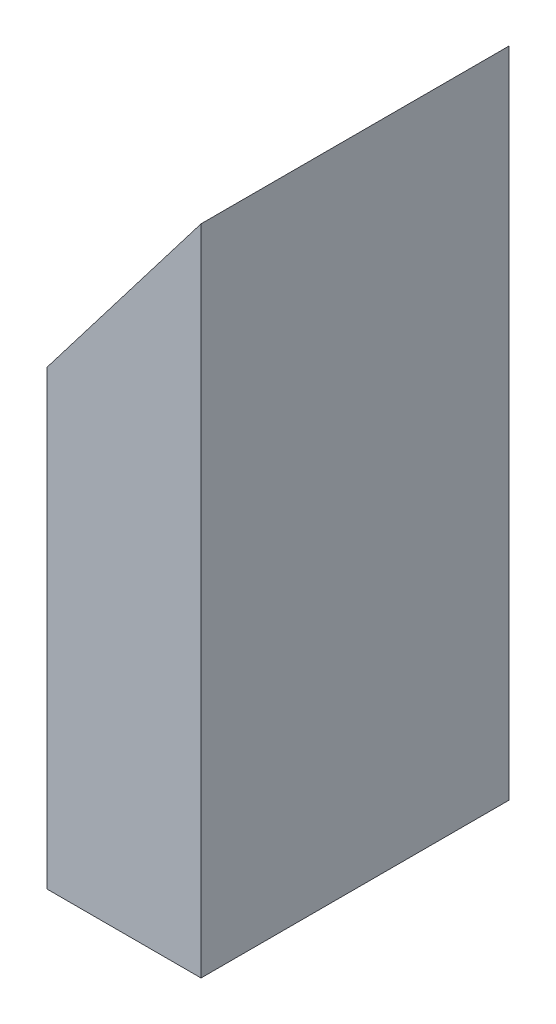
ISO-10303-21;
HEADER;
FILE_DESCRIPTION(('STEP AP214'),'2;1');
FILE_NAME('part.step','',(''),(''),'','','');
FILE_SCHEMA(('AUTOMOTIVE_DESIGN { 1 0 10303 214 1 1 1 1 }'));
ENDSEC;
DATA;
#1=APPLICATION_CONTEXT('core data for automotive mechanical design processes');
#2=APPLICATION_PROTOCOL_DEFINITION('international standard','automotive_design',2000,#1);
#3=PRODUCT_CONTEXT('',#1,'mechanical');
#4=PRODUCT('Part','Part','',(#3));
#5=PRODUCT_RELATED_PRODUCT_CATEGORY('part','',(#4));
#6=PRODUCT_DEFINITION_FORMATION('','',#4);
#7=PRODUCT_DEFINITION_CONTEXT('part definition',#1,'design');
#8=PRODUCT_DEFINITION('design','',#6,#7);
#9=PRODUCT_DEFINITION_SHAPE('','',#8);
#10=(LENGTH_UNIT() NAMED_UNIT(*) SI_UNIT(.MILLI.,.METRE.));
#11=(NAMED_UNIT(*) PLANE_ANGLE_UNIT() SI_UNIT($,.RADIAN.));
#12=(NAMED_UNIT(*) SI_UNIT($,.STERADIAN.) SOLID_ANGLE_UNIT());
#13=UNCERTAINTY_MEASURE_WITH_UNIT(LENGTH_MEASURE(1.E-05),#10,'distance_accuracy_value','');
#14=(GEOMETRIC_REPRESENTATION_CONTEXT(3) GLOBAL_UNCERTAINTY_ASSIGNED_CONTEXT((#13)) GLOBAL_UNIT_ASSIGNED_CONTEXT((#10,
#11,#12)) REPRESENTATION_CONTEXT('',''));
#15=CARTESIAN_POINT('',(0.,0.,0.));
#16=DIRECTION('',(0.,0.,1.));
#17=DIRECTION('',(1.,0.,0.));
#18=AXIS2_PLACEMENT_3D('',#15,#16,#17);
#19=CARTESIAN_POINT('',(-21.5212070795828,25.2792878961903,25.4));
#20=DIRECTION('',(1.,0.,0.));
#21=DIRECTION('',(0.,1.,0.));
#22=AXIS2_PLACEMENT_3D('',#19,#20,#21);
#23=PLANE('',#22);
#24=DIRECTION('',(0.,-1.,0.));
#25=VECTOR('',#24,1.);
#26=CARTESIAN_POINT('',(-21.5212070795828,25.2792878961903,0.));
#27=LINE('',#26,#25);
#28=CARTESIAN_POINT('',(-21.5212070795828,25.2792878961903,0.));
#29=VERTEX_POINT('',#28);
#30=CARTESIAN_POINT('',(-21.521207079583,-11.9907870327744,0.));
#31=VERTEX_POINT('',#30);
#32=EDGE_CURVE('E94',#29,#31,#27,.T.);
#33=ORIENTED_EDGE('',*,*,#32,.T.);
#34=DIRECTION('',(0.,0.,-1.));
#35=VECTOR('',#34,1.);
#36=CARTESIAN_POINT('',(-21.521207079583,-11.9907870327744,25.4));
#37=LINE('',#36,#35);
#38=CARTESIAN_POINT('',(-21.521207079583,-11.9907870327744,25.4));
#39=VERTEX_POINT('',#38);
#40=EDGE_CURVE('E11',#39,#31,#37,.T.);
#41=ORIENTED_EDGE('',*,*,#40,.F.);
#42=DIRECTION('',(0.,-1.,0.));
#43=VECTOR('',#42,1.);
#44=CARTESIAN_POINT('',(-21.5212070795828,25.2792878961903,25.4));
#45=LINE('',#44,#43);
#46=CARTESIAN_POINT('',(-21.5212070795828,25.2792878961903,25.4));
#47=VERTEX_POINT('',#46);
#48=EDGE_CURVE('E103',#47,#39,#45,.T.);
#49=ORIENTED_EDGE('',*,*,#48,.F.);
#50=DIRECTION('',(0.,0.,-1.));
#51=VECTOR('',#50,1.);
#52=CARTESIAN_POINT('',(-21.5212070795828,25.2792878961903,25.4));
#53=LINE('',#52,#51);
#54=EDGE_CURVE('E108',#47,#29,#53,.T.);
#55=ORIENTED_EDGE('',*,*,#54,.T.);
#56=EDGE_LOOP('',(#33,#41,#49,#55));
#57=FACE_BOUND('',#56,.T.);
#58=ADVANCED_FACE('F33',(#57),#23,.F.);
#59=CARTESIAN_POINT('',(-21.521207079583,-11.9907870327744,25.4));
#60=DIRECTION('',(0.,1.,0.));
#61=DIRECTION('',(0.,0.,1.));
#62=AXIS2_PLACEMENT_3D('',#59,#60,#61);
#63=PLANE('',#62);
#64=CARTESIAN_POINT('',(-15.7287644569036,-11.9907870327743,12.7));
#65=DIRECTION('',(0.,-1.,0.));
#66=DIRECTION('',(0.,0.,-1.));
#67=AXIS2_PLACEMENT_3D('',#64,#65,#66);
#68=CIRCLE('',#67,2.55269999999999);
#69=CARTESIAN_POINT('',(-15.7287644569036,-11.9907870327743,10.1473));
#70=VERTEX_POINT('',#69);
#71=EDGE_CURVE('E95',#70,#70,#68,.T.);
#72=ORIENTED_EDGE('',*,*,#71,.F.);
#73=EDGE_LOOP('',(#72));
#74=FACE_BOUND('',#73,.T.);
#75=DIRECTION('',(1.,0.,0.));
#76=VECTOR('',#75,1.);
#77=CARTESIAN_POINT('',(-21.521207079583,-11.9907870327744,0.));
#78=LINE('',#77,#76);
#79=CARTESIAN_POINT('',(-8.81580759515179,-11.9907870327744,0.));
#80=VERTEX_POINT('',#79);
#81=EDGE_CURVE('E98',#31,#80,#78,.T.);
#82=ORIENTED_EDGE('',*,*,#81,.T.);
#83=DIRECTION('',(0.,0.,-1.));
#84=VECTOR('',#83,1.);
#85=CARTESIAN_POINT('',(-8.81580759515179,-11.9907870327744,25.4));
#86=LINE('',#85,#84);
#87=CARTESIAN_POINT('',(-8.81580759515179,-11.9907870327744,25.4));
#88=VERTEX_POINT('',#87);
#89=EDGE_CURVE('E41',#88,#80,#86,.T.);
#90=ORIENTED_EDGE('',*,*,#89,.F.);
#91=DIRECTION('',(1.,0.,0.));
#92=VECTOR('',#91,1.);
#93=CARTESIAN_POINT('',(-21.521207079583,-11.9907870327744,25.4));
#94=LINE('',#93,#92);
#95=EDGE_CURVE('E80',#39,#88,#94,.T.);
#96=ORIENTED_EDGE('',*,*,#95,.F.);
#97=ORIENTED_EDGE('',*,*,#40,.T.);
#98=EDGE_LOOP('',(#82,#90,#96,#97));
#99=FACE_BOUND('',#98,.T.);
#100=ADVANCED_FACE('F131',(#74,#99),#63,.F.);
#101=CARTESIAN_POINT('',(-8.81580759515179,-11.9907870327744,25.4));
#102=DIRECTION('',(-1.,0.,0.));
#103=DIRECTION('',(0.,-1.,0.));
#104=AXIS2_PLACEMENT_3D('',#101,#102,#103);
#105=PLANE('',#104);
#106=DIRECTION('',(0.,1.,0.));
#107=VECTOR('',#106,1.);
#108=CARTESIAN_POINT('',(-8.81580759515179,-11.9907870327744,0.));
#109=LINE('',#108,#107);
#110=CARTESIAN_POINT('',(-8.81580759515158,41.8792397509703,0.));
#111=VERTEX_POINT('',#110);
#112=EDGE_CURVE('E67',#80,#111,#109,.T.);
#113=ORIENTED_EDGE('',*,*,#112,.T.);
#114=DIRECTION('',(0.,0.,-1.));
#115=VECTOR('',#114,1.);
#116=CARTESIAN_POINT('',(-8.81580759515158,41.8792397509703,25.4));
#117=LINE('',#116,#115);
#118=CARTESIAN_POINT('',(-8.81580759515158,41.8792397509703,25.4));
#119=VERTEX_POINT('',#118);
#120=EDGE_CURVE('E114',#119,#111,#117,.T.);
#121=ORIENTED_EDGE('',*,*,#120,.F.);
#122=DIRECTION('',(0.,1.,0.));
#123=VECTOR('',#122,1.);
#124=CARTESIAN_POINT('',(-8.81580759515179,-11.9907870327744,25.4));
#125=LINE('',#124,#123);
#126=EDGE_CURVE('E106',#88,#119,#125,.T.);
#127=ORIENTED_EDGE('',*,*,#126,.F.);
#128=ORIENTED_EDGE('',*,*,#89,.T.);
#129=EDGE_LOOP('',(#113,#121,#127,#128));
#130=FACE_BOUND('',#129,.T.);
#131=ADVANCED_FACE('F116',(#130),#105,.F.);
#132=CARTESIAN_POINT('',(-8.81580759515158,41.8792397509703,25.4));
#133=DIRECTION('',(0.79409649040767,-0.607791710968669,0.));
#134=DIRECTION('',(0.607791710968669,0.79409649040767,0.));
#135=AXIS2_PLACEMENT_3D('',#132,#133,#134);
#136=PLANE('',#135);
#137=DIRECTION('',(-0.607791710968669,-0.79409649040767,0.));
#138=VECTOR('',#137,1.);
#139=CARTESIAN_POINT('',(-8.81580759515158,41.8792397509703,0.));
#140=LINE('',#139,#138);
#141=EDGE_CURVE('E73',#111,#29,#140,.T.);
#142=ORIENTED_EDGE('',*,*,#141,.T.);
#143=ORIENTED_EDGE('',*,*,#54,.F.);
#144=DIRECTION('',(-0.607791710968669,-0.79409649040767,0.));
#145=VECTOR('',#144,1.);
#146=CARTESIAN_POINT('',(-8.81580759515158,41.8792397509703,25.4));
#147=LINE('',#146,#145);
#148=EDGE_CURVE('E49',#119,#47,#147,.T.);
#149=ORIENTED_EDGE('',*,*,#148,.F.);
#150=ORIENTED_EDGE('',*,*,#120,.T.);
#151=EDGE_LOOP('',(#142,#143,#149,#150));
#152=FACE_BOUND('',#151,.T.);
#153=ADVANCED_FACE('F122',(#152),#136,.F.);
#154=CARTESIAN_POINT('',(-21.521207079583,-11.9907870327744,25.4));
#155=DIRECTION('',(0.,0.,1.));
#156=DIRECTION('',(1.,0.,0.));
#157=AXIS2_PLACEMENT_3D('',#154,#155,#156);
#158=PLANE('',#157);
#159=ORIENTED_EDGE('',*,*,#48,.T.);
#160=ORIENTED_EDGE('',*,*,#95,.T.);
#161=ORIENTED_EDGE('',*,*,#126,.T.);
#162=ORIENTED_EDGE('',*,*,#148,.T.);
#163=EDGE_LOOP('',(#159,#160,#161,#162));
#164=FACE_BOUND('',#163,.T.);
#165=ADVANCED_FACE('F124',(#164),#158,.T.);
#166=CARTESIAN_POINT('',(-21.521207079583,-11.9907870327744,0.));
#167=DIRECTION('',(0.,0.,1.));
#168=DIRECTION('',(1.,0.,0.));
#169=AXIS2_PLACEMENT_3D('',#166,#167,#168);
#170=PLANE('',#169);
#171=ORIENTED_EDGE('',*,*,#32,.F.);
#172=ORIENTED_EDGE('',*,*,#141,.F.);
#173=ORIENTED_EDGE('',*,*,#112,.F.);
#174=ORIENTED_EDGE('',*,*,#81,.F.);
#175=EDGE_LOOP('',(#171,#172,#173,#174));
#176=FACE_BOUND('',#175,.T.);
#177=ADVANCED_FACE('F88',(#176),#170,.F.);
#178=CARTESIAN_POINT('',(-15.7287644569036,4.01121296722566,12.7));
#179=DIRECTION('',(0.,-1.,0.));
#180=DIRECTION('',(0.,0.,-1.));
#181=AXIS2_PLACEMENT_3D('',#178,#179,#180);
#182=CONICAL_SURFACE('',#181,2.5527,1.02974425867665);
#183=CARTESIAN_POINT('',(-15.7287644569036,5.54502986941732,12.7));
#184=VERTEX_POINT('',#183);
#185=VERTEX_LOOP('',#184);
#186=FACE_BOUND('',#185,.T.);
#187=CARTESIAN_POINT('',(-15.7287644569036,4.01121296722566,12.7));
#188=DIRECTION('',(0.,-1.,0.));
#189=DIRECTION('',(0.,0.,-1.));
#190=AXIS2_PLACEMENT_3D('',#187,#188,#189);
#191=CIRCLE('',#190,2.5527);
#192=CARTESIAN_POINT('',(-15.7287644569036,4.01121296722566,10.1473));
#193=VERTEX_POINT('',#192);
#194=EDGE_CURVE('E92',#193,#193,#191,.T.);
#195=ORIENTED_EDGE('',*,*,#194,.T.);
#196=EDGE_LOOP('',(#195));
#197=FACE_BOUND('',#196,.T.);
#198=ADVANCED_FACE('F84',(#186,#197),#182,.F.);
#199=CARTESIAN_POINT('',(-15.7287644569036,-11.9907870327743,12.7));
#200=DIRECTION('',(0.,-1.,0.));
#201=DIRECTION('',(0.,0.,-1.));
#202=AXIS2_PLACEMENT_3D('',#199,#200,#201);
#203=CYLINDRICAL_SURFACE('',#202,2.55269999999999);
#204=ORIENTED_EDGE('',*,*,#194,.F.);
#205=EDGE_LOOP('',(#204));
#206=FACE_BOUND('',#205,.T.);
#207=ORIENTED_EDGE('',*,*,#71,.T.);
#208=EDGE_LOOP('',(#207));
#209=FACE_BOUND('',#208,.T.);
#210=ADVANCED_FACE('F87',(#206,#209),#203,.F.);
#211=CLOSED_SHELL('',(#58,#100,#131,#153,#165,#177,#198,#210));
#212=MANIFOLD_SOLID_BREP('B2',#211);
#213=ADVANCED_BREP_SHAPE_REPRESENTATION('',(#18,#212),#14);
#214=SHAPE_DEFINITION_REPRESENTATION(#9,#213);
ENDSEC;
END-ISO-10303-21;
